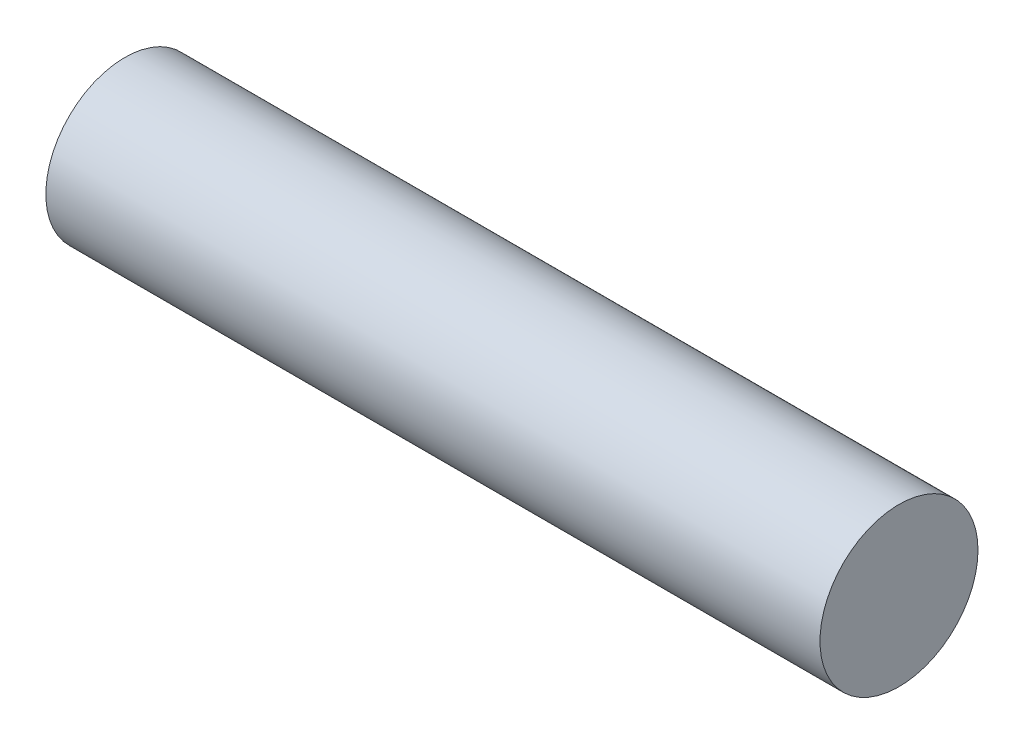
ISO-10303-21;
HEADER;
FILE_DESCRIPTION(('STEP AP214'),'2;1');
FILE_NAME('part.step','',(''),(''),'','','');
FILE_SCHEMA(('AUTOMOTIVE_DESIGN { 1 0 10303 214 1 1 1 1 }'));
ENDSEC;
DATA;
#1=APPLICATION_CONTEXT('core data for automotive mechanical design processes');
#2=APPLICATION_PROTOCOL_DEFINITION('international standard','automotive_design',2000,#1);
#3=PRODUCT_CONTEXT('',#1,'mechanical');
#4=PRODUCT('Part','Part','',(#3));
#5=PRODUCT_RELATED_PRODUCT_CATEGORY('part','',(#4));
#6=PRODUCT_DEFINITION_FORMATION('','',#4);
#7=PRODUCT_DEFINITION_CONTEXT('part definition',#1,'design');
#8=PRODUCT_DEFINITION('design','',#6,#7);
#9=PRODUCT_DEFINITION_SHAPE('','',#8);
#10=(LENGTH_UNIT() NAMED_UNIT(*) SI_UNIT(.MILLI.,.METRE.));
#11=(NAMED_UNIT(*) PLANE_ANGLE_UNIT() SI_UNIT($,.RADIAN.));
#12=(NAMED_UNIT(*) SI_UNIT($,.STERADIAN.) SOLID_ANGLE_UNIT());
#13=UNCERTAINTY_MEASURE_WITH_UNIT(LENGTH_MEASURE(1.E-05),#10,'distance_accuracy_value','');
#14=(GEOMETRIC_REPRESENTATION_CONTEXT(3) GLOBAL_UNCERTAINTY_ASSIGNED_CONTEXT((#13)) GLOBAL_UNIT_ASSIGNED_CONTEXT((#10,
#11,#12)) REPRESENTATION_CONTEXT('',''));
#15=CARTESIAN_POINT('',(0.,0.,0.));
#16=DIRECTION('',(0.,0.,1.));
#17=DIRECTION('',(1.,0.,0.));
#18=AXIS2_PLACEMENT_3D('',#15,#16,#17);
#19=CARTESIAN_POINT('',(311.15,0.,0.));
#20=DIRECTION('',(-1.,0.,0.));
#21=DIRECTION('',(0.,0.,1.));
#22=AXIS2_PLACEMENT_3D('',#19,#20,#21);
#23=CYLINDRICAL_SURFACE('',#22,31.75);
#24=CARTESIAN_POINT('',(311.15,0.,0.));
#25=DIRECTION('',(1.,0.,0.));
#26=DIRECTION('',(0.,0.,-1.));
#27=AXIS2_PLACEMENT_3D('',#24,#25,#26);
#28=CIRCLE('',#27,31.75);
#29=CARTESIAN_POINT('',(311.15,0.,-31.75));
#30=VERTEX_POINT('',#29);
#31=EDGE_CURVE('E10',#30,#30,#28,.T.);
#32=ORIENTED_EDGE('',*,*,#31,.F.);
#33=EDGE_LOOP('',(#32));
#34=FACE_BOUND('',#33,.T.);
#35=CARTESIAN_POINT('',(0.,0.,0.));
#36=DIRECTION('',(1.,0.,0.));
#37=DIRECTION('',(0.,0.,-1.));
#38=AXIS2_PLACEMENT_3D('',#35,#36,#37);
#39=CIRCLE('',#38,31.75);
#40=CARTESIAN_POINT('',(0.,0.,-31.75));
#41=VERTEX_POINT('',#40);
#42=EDGE_CURVE('E33',#41,#41,#39,.T.);
#43=ORIENTED_EDGE('',*,*,#42,.T.);
#44=EDGE_LOOP('',(#43));
#45=FACE_BOUND('',#44,.T.);
#46=ADVANCED_FACE('F30',(#34,#45),#23,.T.);
#47=CARTESIAN_POINT('',(311.15,0.,0.));
#48=DIRECTION('',(1.,0.,0.));
#49=DIRECTION('',(0.,0.,-1.));
#50=AXIS2_PLACEMENT_3D('',#47,#48,#49);
#51=PLANE('',#50);
#52=ORIENTED_EDGE('',*,*,#31,.T.);
#53=EDGE_LOOP('',(#52));
#54=FACE_BOUND('',#53,.T.);
#55=ADVANCED_FACE('F45',(#54),#51,.T.);
#56=CARTESIAN_POINT('',(0.,0.,0.));
#57=DIRECTION('',(1.,0.,0.));
#58=DIRECTION('',(0.,0.,-1.));
#59=AXIS2_PLACEMENT_3D('',#56,#57,#58);
#60=PLANE('',#59);
#61=ORIENTED_EDGE('',*,*,#42,.F.);
#62=EDGE_LOOP('',(#61));
#63=FACE_BOUND('',#62,.T.);
#64=ADVANCED_FACE('F43',(#63),#60,.F.);
#65=CLOSED_SHELL('',(#46,#55,#64));
#66=MANIFOLD_SOLID_BREP('B2',#65);
#67=ADVANCED_BREP_SHAPE_REPRESENTATION('',(#18,#66),#14);
#68=SHAPE_DEFINITION_REPRESENTATION(#9,#67);
ENDSEC;
END-ISO-10303-21;
